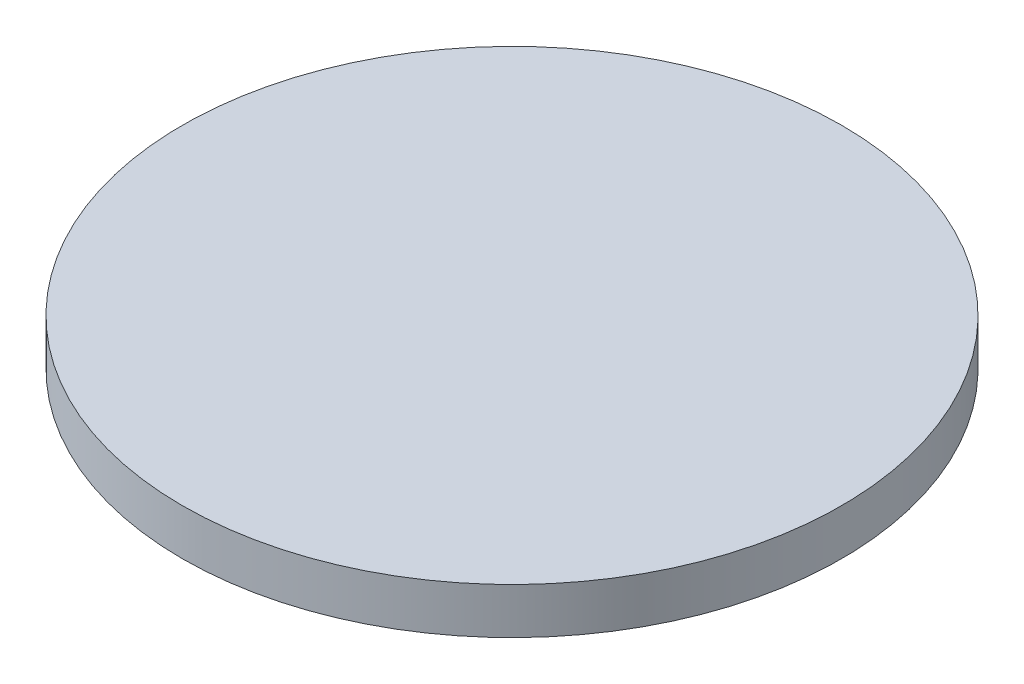
ISO-10303-21;
HEADER;
FILE_DESCRIPTION(('STEP AP214'),'2;1');
FILE_NAME('part.step','',(''),(''),'','','');
FILE_SCHEMA(('AUTOMOTIVE_DESIGN { 1 0 10303 214 1 1 1 1 }'));
ENDSEC;
DATA;
#1=APPLICATION_CONTEXT('core data for automotive mechanical design processes');
#2=APPLICATION_PROTOCOL_DEFINITION('international standard','automotive_design',2000,#1);
#3=PRODUCT_CONTEXT('',#1,'mechanical');
#4=PRODUCT('Part','Part','',(#3));
#5=PRODUCT_RELATED_PRODUCT_CATEGORY('part','',(#4));
#6=PRODUCT_DEFINITION_FORMATION('','',#4);
#7=PRODUCT_DEFINITION_CONTEXT('part definition',#1,'design');
#8=PRODUCT_DEFINITION('design','',#6,#7);
#9=PRODUCT_DEFINITION_SHAPE('','',#8);
#10=(LENGTH_UNIT() NAMED_UNIT(*) SI_UNIT(.MILLI.,.METRE.));
#11=(NAMED_UNIT(*) PLANE_ANGLE_UNIT() SI_UNIT($,.RADIAN.));
#12=(NAMED_UNIT(*) SI_UNIT($,.STERADIAN.) SOLID_ANGLE_UNIT());
#13=UNCERTAINTY_MEASURE_WITH_UNIT(LENGTH_MEASURE(1.E-05),#10,'distance_accuracy_value','');
#14=(GEOMETRIC_REPRESENTATION_CONTEXT(3) GLOBAL_UNCERTAINTY_ASSIGNED_CONTEXT((#13)) GLOBAL_UNIT_ASSIGNED_CONTEXT((#10,
#11,#12)) REPRESENTATION_CONTEXT('',''));
#15=CARTESIAN_POINT('',(0.,0.,0.));
#16=DIRECTION('',(0.,0.,1.));
#17=DIRECTION('',(1.,0.,0.));
#18=AXIS2_PLACEMENT_3D('',#15,#16,#17);
#19=CARTESIAN_POINT('',(0.,3.,0.));
#20=DIRECTION('',(0.,-1.,0.));
#21=DIRECTION('',(0.,0.,-1.));
#22=AXIS2_PLACEMENT_3D('',#19,#20,#21);
#23=CYLINDRICAL_SURFACE('',#22,21.5);
#24=CARTESIAN_POINT('',(0.,3.,0.));
#25=DIRECTION('',(0.,1.,0.));
#26=DIRECTION('',(0.,0.,1.));
#27=AXIS2_PLACEMENT_3D('',#24,#25,#26);
#28=CIRCLE('',#27,21.5);
#29=CARTESIAN_POINT('',(0.,3.,21.5));
#30=VERTEX_POINT('',#29);
#31=EDGE_CURVE('E10',#30,#30,#28,.T.);
#32=ORIENTED_EDGE('',*,*,#31,.F.);
#33=EDGE_LOOP('',(#32));
#34=FACE_BOUND('',#33,.T.);
#35=CARTESIAN_POINT('',(0.,0.,0.));
#36=DIRECTION('',(0.,1.,0.));
#37=DIRECTION('',(0.,0.,1.));
#38=AXIS2_PLACEMENT_3D('',#35,#36,#37);
#39=CIRCLE('',#38,21.5);
#40=CARTESIAN_POINT('',(0.,0.,21.5));
#41=VERTEX_POINT('',#40);
#42=EDGE_CURVE('E38',#41,#41,#39,.T.);
#43=ORIENTED_EDGE('',*,*,#42,.T.);
#44=EDGE_LOOP('',(#43));
#45=FACE_BOUND('',#44,.T.);
#46=ADVANCED_FACE('F35',(#34,#45),#23,.T.);
#47=CARTESIAN_POINT('',(0.,3.,0.));
#48=DIRECTION('',(0.,1.,0.));
#49=DIRECTION('',(0.,0.,1.));
#50=AXIS2_PLACEMENT_3D('',#47,#48,#49);
#51=PLANE('',#50);
#52=ORIENTED_EDGE('',*,*,#31,.T.);
#53=EDGE_LOOP('',(#52));
#54=FACE_BOUND('',#53,.T.);
#55=ADVANCED_FACE('F50',(#54),#51,.T.);
#56=CARTESIAN_POINT('',(0.,0.,0.));
#57=DIRECTION('',(0.,1.,0.));
#58=DIRECTION('',(0.,0.,1.));
#59=AXIS2_PLACEMENT_3D('',#56,#57,#58);
#60=PLANE('',#59);
#61=ORIENTED_EDGE('',*,*,#42,.F.);
#62=EDGE_LOOP('',(#61));
#63=FACE_BOUND('',#62,.T.);
#64=ADVANCED_FACE('F48',(#63),#60,.F.);
#65=CLOSED_SHELL('',(#46,#55,#64));
#66=MANIFOLD_SOLID_BREP('B2',#65);
#67=ADVANCED_BREP_SHAPE_REPRESENTATION('',(#18,#66),#14);
#68=SHAPE_DEFINITION_REPRESENTATION(#9,#67);
ENDSEC;
END-ISO-10303-21;
